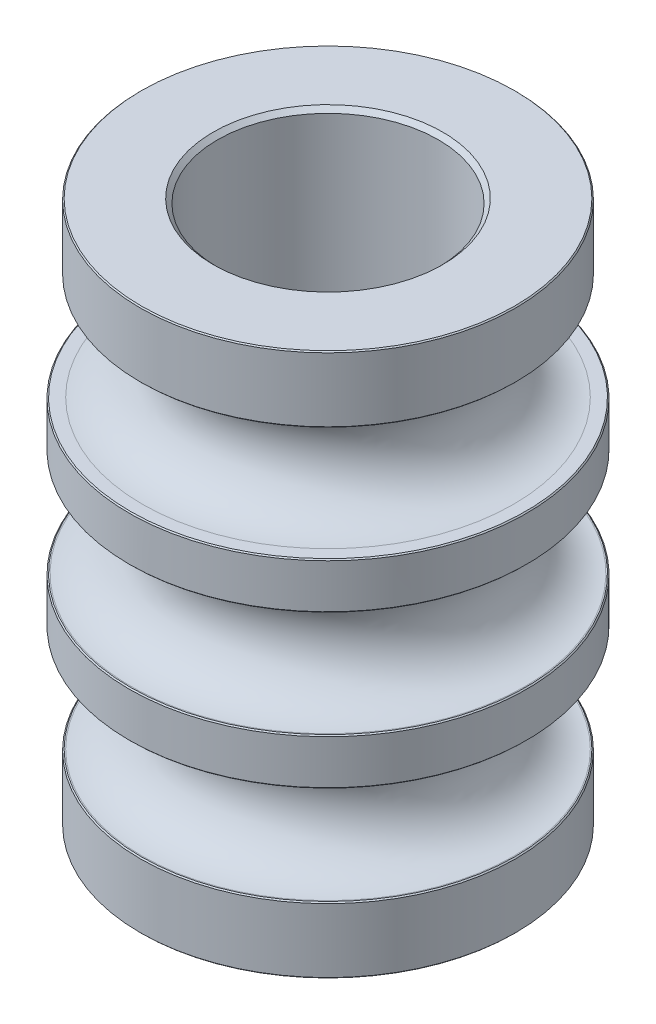
ISO-10303-21;
HEADER;
FILE_DESCRIPTION(('STEP AP214'),'2;1');
FILE_NAME('part.step','',(''),(''),'','','');
FILE_SCHEMA(('AUTOMOTIVE_DESIGN { 1 0 10303 214 1 1 1 1 }'));
ENDSEC;
DATA;
#1=APPLICATION_CONTEXT('core data for automotive mechanical design processes');
#2=APPLICATION_PROTOCOL_DEFINITION('international standard','automotive_design',2000,#1);
#3=PRODUCT_CONTEXT('',#1,'mechanical');
#4=PRODUCT('Part','Part','',(#3));
#5=PRODUCT_RELATED_PRODUCT_CATEGORY('part','',(#4));
#6=PRODUCT_DEFINITION_FORMATION('','',#4);
#7=PRODUCT_DEFINITION_CONTEXT('part definition',#1,'design');
#8=PRODUCT_DEFINITION('design','',#6,#7);
#9=PRODUCT_DEFINITION_SHAPE('','',#8);
#10=(LENGTH_UNIT() NAMED_UNIT(*) SI_UNIT(.MILLI.,.METRE.));
#11=(NAMED_UNIT(*) PLANE_ANGLE_UNIT() SI_UNIT($,.RADIAN.));
#12=(NAMED_UNIT(*) SI_UNIT($,.STERADIAN.) SOLID_ANGLE_UNIT());
#13=UNCERTAINTY_MEASURE_WITH_UNIT(LENGTH_MEASURE(1.E-05),#10,'distance_accuracy_value','');
#14=(GEOMETRIC_REPRESENTATION_CONTEXT(3) GLOBAL_UNCERTAINTY_ASSIGNED_CONTEXT((#13)) GLOBAL_UNIT_ASSIGNED_CONTEXT((#10,
#11,#12)) REPRESENTATION_CONTEXT('',''));
#15=CARTESIAN_POINT('',(0.,0.,0.));
#16=DIRECTION('',(0.,0.,1.));
#17=DIRECTION('',(1.,0.,0.));
#18=AXIS2_PLACEMENT_3D('',#15,#16,#17);
#19=CARTESIAN_POINT('',(0.,12.3,0.));
#20=DIRECTION('',(0.,-1.,0.));
#21=DIRECTION('',(0.,0.,-1.));
#22=AXIS2_PLACEMENT_3D('',#19,#20,#21);
#23=TOROIDAL_SURFACE('',#22,8.9,2.4);
#24=CARTESIAN_POINT('',(0.,9.9,0.));
#25=DIRECTION('',(0.,1.,0.));
#26=DIRECTION('',(1.,0.,0.));
#27=AXIS2_PLACEMENT_3D('',#24,#25,#26);
#28=CIRCLE('',#27,8.9);
#29=CARTESIAN_POINT('',(8.9,9.9,0.));
#30=VERTEX_POINT('',#29);
#31=EDGE_CURVE('E207',#30,#30,#28,.F.);
#32=ORIENTED_EDGE('',*,*,#31,.F.);
#33=EDGE_LOOP('',(#32));
#34=FACE_BOUND('',#33,.T.);
#35=CARTESIAN_POINT('',(0.,14.7,0.));
#36=DIRECTION('',(0.,-1.,0.));
#37=DIRECTION('',(1.,0.,0.));
#38=AXIS2_PLACEMENT_3D('',#35,#36,#37);
#39=CIRCLE('',#38,8.9);
#40=CARTESIAN_POINT('',(8.9,14.7,0.));
#41=VERTEX_POINT('',#40);
#42=EDGE_CURVE('E163',#41,#41,#39,.F.);
#43=ORIENTED_EDGE('',*,*,#42,.F.);
#44=EDGE_LOOP('',(#43));
#45=FACE_BOUND('',#44,.T.);
#46=ADVANCED_FACE('F15',(#34,#45),#23,.F.);
#47=CARTESIAN_POINT('',(8.95,9.9,0.));
#48=DIRECTION('',(0.,1.,0.));
#49=DIRECTION('',(0.,0.,1.));
#50=AXIS2_PLACEMENT_3D('',#47,#48,#49);
#51=PLANE('',#50);
#52=ORIENTED_EDGE('',*,*,#31,.T.);
#53=EDGE_LOOP('',(#52));
#54=FACE_BOUND('',#53,.T.);
#55=CARTESIAN_POINT('',(0.,9.90000000002244,0.));
#56=DIRECTION('',(0.,-1.,0.));
#57=DIRECTION('',(0.,0.,-1.));
#58=AXIS2_PLACEMENT_3D('',#55,#56,#57);
#59=CIRCLE('',#58,8.95000000002244);
#60=CARTESIAN_POINT('',(0.,9.90000000002244,-8.95000000002244));
#61=VERTEX_POINT('',#60);
#62=EDGE_CURVE('E20',#61,#61,#59,.T.);
#63=ORIENTED_EDGE('',*,*,#62,.F.);
#64=EDGE_LOOP('',(#63));
#65=FACE_BOUND('',#64,.T.);
#66=ADVANCED_FACE('F180',(#54,#65),#51,.T.);
#67=CARTESIAN_POINT('',(8.95,14.7,0.));
#68=DIRECTION('',(0.,-1.,0.));
#69=DIRECTION('',(0.,0.,-1.));
#70=AXIS2_PLACEMENT_3D('',#67,#68,#69);
#71=PLANE('',#70);
#72=ORIENTED_EDGE('',*,*,#42,.T.);
#73=EDGE_LOOP('',(#72));
#74=FACE_BOUND('',#73,.T.);
#75=CARTESIAN_POINT('',(0.,14.6999999999776,0.));
#76=DIRECTION('',(0.,1.,0.));
#77=DIRECTION('',(0.,0.,1.));
#78=AXIS2_PLACEMENT_3D('',#75,#76,#77);
#79=CIRCLE('',#78,8.95000000002244);
#80=CARTESIAN_POINT('',(0.,14.6999999999776,8.95000000002244));
#81=VERTEX_POINT('',#80);
#82=EDGE_CURVE('E156',#81,#81,#79,.T.);
#83=ORIENTED_EDGE('',*,*,#82,.F.);
#84=EDGE_LOOP('',(#83));
#85=FACE_BOUND('',#84,.T.);
#86=ADVANCED_FACE('F170',(#74,#85),#71,.T.);
#87=CARTESIAN_POINT('',(0.,9.84999999997756,0.));
#88=DIRECTION('',(0.,-1.,0.));
#89=DIRECTION('',(0.,0.,-1.));
#90=AXIS2_PLACEMENT_3D('',#87,#88,#89);
#91=CONICAL_SURFACE('',#90,8.99999999997756,0.785398162499989);
#92=CARTESIAN_POINT('',(0.,9.85,0.));
#93=DIRECTION('',(0.,-1.,0.));
#94=DIRECTION('',(0.,0.,-1.));
#95=AXIS2_PLACEMENT_3D('',#92,#93,#94);
#96=CIRCLE('',#95,9.);
#97=CARTESIAN_POINT('',(0.,9.85,-9.));
#98=VERTEX_POINT('',#97);
#99=EDGE_CURVE('E151',#98,#98,#96,.T.);
#100=ORIENTED_EDGE('',*,*,#99,.F.);
#101=EDGE_LOOP('',(#100));
#102=FACE_BOUND('',#101,.T.);
#103=ORIENTED_EDGE('',*,*,#62,.T.);
#104=EDGE_LOOP('',(#103));
#105=FACE_BOUND('',#104,.T.);
#106=ADVANCED_FACE('F179',(#102,#105),#91,.T.);
#107=CARTESIAN_POINT('',(0.,14.7500000000224,0.));
#108=DIRECTION('',(0.,1.,0.));
#109=DIRECTION('',(0.,0.,1.));
#110=AXIS2_PLACEMENT_3D('',#107,#108,#109);
#111=CONICAL_SURFACE('',#110,8.99999999997756,0.785398162500006);
#112=ORIENTED_EDGE('',*,*,#82,.T.);
#113=EDGE_LOOP('',(#112));
#114=FACE_BOUND('',#113,.T.);
#115=CARTESIAN_POINT('',(0.,14.75,0.));
#116=DIRECTION('',(0.,-1.,0.));
#117=DIRECTION('',(0.,0.,-1.));
#118=AXIS2_PLACEMENT_3D('',#115,#116,#117);
#119=CIRCLE('',#118,9.);
#120=CARTESIAN_POINT('',(0.,14.75,-9.));
#121=VERTEX_POINT('',#120);
#122=EDGE_CURVE('E146',#121,#121,#119,.F.);
#123=ORIENTED_EDGE('',*,*,#122,.F.);
#124=EDGE_LOOP('',(#123));
#125=FACE_BOUND('',#124,.T.);
#126=ADVANCED_FACE('F244',(#114,#125),#111,.T.);
#127=CARTESIAN_POINT('',(0.,8.85,0.));
#128=DIRECTION('',(0.,-1.,0.));
#129=DIRECTION('',(0.,0.,-1.));
#130=AXIS2_PLACEMENT_3D('',#127,#128,#129);
#131=CYLINDRICAL_SURFACE('',#130,9.);
#132=ORIENTED_EDGE('',*,*,#99,.T.);
#133=EDGE_LOOP('',(#132));
#134=FACE_BOUND('',#133,.T.);
#135=CARTESIAN_POINT('',(0.,7.85000000002244,0.));
#136=DIRECTION('',(0.,1.,0.));
#137=DIRECTION('',(-1.,0.,0.));
#138=AXIS2_PLACEMENT_3D('',#135,#136,#137);
#139=CIRCLE('',#138,8.99999999997757);
#140=CARTESIAN_POINT('',(-8.99999999997757,7.85000000002244,0.));
#141=VERTEX_POINT('',#140);
#142=EDGE_CURVE('E141',#141,#141,#139,.F.);
#143=ORIENTED_EDGE('',*,*,#142,.F.);
#144=EDGE_LOOP('',(#143));
#145=FACE_BOUND('',#144,.T.);
#146=ADVANCED_FACE('F250',(#134,#145),#131,.T.);
#147=CARTESIAN_POINT('',(0.,15.75,0.));
#148=DIRECTION('',(0.,-1.,0.));
#149=DIRECTION('',(0.,0.,-1.));
#150=AXIS2_PLACEMENT_3D('',#147,#148,#149);
#151=CYLINDRICAL_SURFACE('',#150,9.);
#152=CARTESIAN_POINT('',(0.,16.7499999999776,0.));
#153=DIRECTION('',(0.,-1.,0.));
#154=DIRECTION('',(-1.,0.,0.));
#155=AXIS2_PLACEMENT_3D('',#152,#153,#154);
#156=CIRCLE('',#155,8.99999999997756);
#157=CARTESIAN_POINT('',(-8.99999999997756,16.7499999999776,0.));
#158=VERTEX_POINT('',#157);
#159=EDGE_CURVE('E132',#158,#158,#156,.F.);
#160=ORIENTED_EDGE('',*,*,#159,.F.);
#161=EDGE_LOOP('',(#160));
#162=FACE_BOUND('',#161,.T.);
#163=ORIENTED_EDGE('',*,*,#122,.T.);
#164=EDGE_LOOP('',(#163));
#165=FACE_BOUND('',#164,.T.);
#166=ADVANCED_FACE('F358',(#162,#165),#151,.T.);
#167=CARTESIAN_POINT('',(0.,7.85000000002244,0.));
#168=DIRECTION('',(0.,1.,0.));
#169=DIRECTION('',(0.,0.,1.));
#170=AXIS2_PLACEMENT_3D('',#167,#168,#169);
#171=CONICAL_SURFACE('',#170,8.99999999997757,0.785398162500006);
#172=CARTESIAN_POINT('',(0.,7.79999999997756,0.));
#173=DIRECTION('',(0.,1.,0.));
#174=DIRECTION('',(0.,0.,1.));
#175=AXIS2_PLACEMENT_3D('',#172,#173,#174);
#176=CIRCLE('',#175,8.95000000002244);
#177=CARTESIAN_POINT('',(0.,7.79999999997756,8.95000000002244));
#178=VERTEX_POINT('',#177);
#179=EDGE_CURVE('E140',#178,#178,#176,.F.);
#180=ORIENTED_EDGE('',*,*,#179,.F.);
#181=EDGE_LOOP('',(#180));
#182=FACE_BOUND('',#181,.T.);
#183=ORIENTED_EDGE('',*,*,#142,.T.);
#184=EDGE_LOOP('',(#183));
#185=FACE_BOUND('',#184,.T.);
#186=ADVANCED_FACE('F350',(#182,#185),#171,.T.);
#187=CARTESIAN_POINT('',(0.,16.7499999999776,0.));
#188=DIRECTION('',(0.,-1.,0.));
#189=DIRECTION('',(0.,0.,-1.));
#190=AXIS2_PLACEMENT_3D('',#187,#188,#189);
#191=CONICAL_SURFACE('',#190,8.99999999997756,0.785398162500024);
#192=ORIENTED_EDGE('',*,*,#159,.T.);
#193=EDGE_LOOP('',(#192));
#194=FACE_BOUND('',#193,.T.);
#195=CARTESIAN_POINT('',(0.,16.8000000000224,0.));
#196=DIRECTION('',(0.,-1.,0.));
#197=DIRECTION('',(0.,0.,-1.));
#198=AXIS2_PLACEMENT_3D('',#195,#196,#197);
#199=CIRCLE('',#198,8.95000000002243);
#200=CARTESIAN_POINT('',(0.,16.8000000000224,-8.95000000002243));
#201=VERTEX_POINT('',#200);
#202=EDGE_CURVE('E231',#201,#201,#199,.F.);
#203=ORIENTED_EDGE('',*,*,#202,.F.);
#204=EDGE_LOOP('',(#203));
#205=FACE_BOUND('',#204,.T.);
#206=ADVANCED_FACE('F343',(#194,#205),#191,.T.);
#207=CARTESIAN_POINT('',(8.7,7.8,0.));
#208=DIRECTION('',(0.,-1.,0.));
#209=DIRECTION('',(0.,0.,-1.));
#210=AXIS2_PLACEMENT_3D('',#207,#208,#209);
#211=PLANE('',#210);
#212=CARTESIAN_POINT('',(0.,7.8,0.));
#213=DIRECTION('',(0.,-1.,0.));
#214=DIRECTION('',(1.,0.,0.));
#215=AXIS2_PLACEMENT_3D('',#212,#213,#214);
#216=CIRCLE('',#215,8.4);
#217=CARTESIAN_POINT('',(8.4,7.8,0.));
#218=VERTEX_POINT('',#217);
#219=EDGE_CURVE('E234',#218,#218,#216,.F.);
#220=ORIENTED_EDGE('',*,*,#219,.T.);
#221=EDGE_LOOP('',(#220));
#222=FACE_BOUND('',#221,.T.);
#223=ORIENTED_EDGE('',*,*,#179,.T.);
#224=EDGE_LOOP('',(#223));
#225=FACE_BOUND('',#224,.T.);
#226=ADVANCED_FACE('F336',(#222,#225),#211,.T.);
#227=CARTESIAN_POINT('',(8.7,16.8,0.));
#228=DIRECTION('',(0.,1.,0.));
#229=DIRECTION('',(0.,0.,1.));
#230=AXIS2_PLACEMENT_3D('',#227,#228,#229);
#231=PLANE('',#230);
#232=CARTESIAN_POINT('',(0.,16.8,0.));
#233=DIRECTION('',(0.,1.,0.));
#234=DIRECTION('',(1.,0.,0.));
#235=AXIS2_PLACEMENT_3D('',#232,#233,#234);
#236=CIRCLE('',#235,8.4);
#237=CARTESIAN_POINT('',(8.4,16.8,0.));
#238=VERTEX_POINT('',#237);
#239=EDGE_CURVE('E511',#238,#238,#236,.F.);
#240=ORIENTED_EDGE('',*,*,#239,.T.);
#241=EDGE_LOOP('',(#240));
#242=FACE_BOUND('',#241,.T.);
#243=ORIENTED_EDGE('',*,*,#202,.T.);
#244=EDGE_LOOP('',(#243));
#245=FACE_BOUND('',#244,.T.);
#246=ADVANCED_FACE('F117',(#242,#245),#231,.T.);
#247=CARTESIAN_POINT('',(0.,5.4,0.));
#248=DIRECTION('',(0.,-1.,0.));
#249=DIRECTION('',(0.,0.,-1.));
#250=AXIS2_PLACEMENT_3D('',#247,#248,#249);
#251=TOROIDAL_SURFACE('',#250,8.4,2.4);
#252=CARTESIAN_POINT('',(0.,3.,0.));
#253=DIRECTION('',(0.,1.,0.));
#254=DIRECTION('',(1.,0.,0.));
#255=AXIS2_PLACEMENT_3D('',#252,#253,#254);
#256=CIRCLE('',#255,8.4);
#257=CARTESIAN_POINT('',(8.4,3.,0.));
#258=VERTEX_POINT('',#257);
#259=EDGE_CURVE('E520',#258,#258,#256,.F.);
#260=ORIENTED_EDGE('',*,*,#259,.F.);
#261=EDGE_LOOP('',(#260));
#262=FACE_BOUND('',#261,.T.);
#263=ORIENTED_EDGE('',*,*,#219,.F.);
#264=EDGE_LOOP('',(#263));
#265=FACE_BOUND('',#264,.T.);
#266=ADVANCED_FACE('F113',(#262,#265),#251,.F.);
#267=CARTESIAN_POINT('',(0.,19.2,0.));
#268=DIRECTION('',(0.,-1.,0.));
#269=DIRECTION('',(0.,0.,-1.));
#270=AXIS2_PLACEMENT_3D('',#267,#268,#269);
#271=TOROIDAL_SURFACE('',#270,8.4,2.4);
#272=ORIENTED_EDGE('',*,*,#239,.F.);
#273=EDGE_LOOP('',(#272));
#274=FACE_BOUND('',#273,.T.);
#275=CARTESIAN_POINT('',(0.,21.6,0.));
#276=DIRECTION('',(0.,-1.,0.));
#277=DIRECTION('',(1.,0.,0.));
#278=AXIS2_PLACEMENT_3D('',#275,#276,#277);
#279=CIRCLE('',#278,8.4);
#280=CARTESIAN_POINT('',(8.4,21.6,0.));
#281=VERTEX_POINT('',#280);
#282=EDGE_CURVE('E62',#281,#281,#279,.F.);
#283=ORIENTED_EDGE('',*,*,#282,.F.);
#284=EDGE_LOOP('',(#283));
#285=FACE_BOUND('',#284,.T.);
#286=ADVANCED_FACE('F85',(#274,#285),#271,.F.);
#287=CARTESIAN_POINT('',(8.45,3.,0.));
#288=DIRECTION('',(0.,1.,0.));
#289=DIRECTION('',(0.,0.,1.));
#290=AXIS2_PLACEMENT_3D('',#287,#288,#289);
#291=PLANE('',#290);
#292=ORIENTED_EDGE('',*,*,#259,.T.);
#293=EDGE_LOOP('',(#292));
#294=FACE_BOUND('',#293,.T.);
#295=CARTESIAN_POINT('',(0.,3.00000000002244,0.));
#296=DIRECTION('',(0.,-1.,0.));
#297=DIRECTION('',(0.,0.,-1.));
#298=AXIS2_PLACEMENT_3D('',#295,#296,#297);
#299=CIRCLE('',#298,8.45000000002244);
#300=CARTESIAN_POINT('',(0.,3.00000000002244,-8.45000000002244));
#301=VERTEX_POINT('',#300);
#302=EDGE_CURVE('E228',#301,#301,#299,.T.);
#303=ORIENTED_EDGE('',*,*,#302,.F.);
#304=EDGE_LOOP('',(#303));
#305=FACE_BOUND('',#304,.T.);
#306=ADVANCED_FACE('F80',(#294,#305),#291,.T.);
#307=CARTESIAN_POINT('',(8.45,21.6,0.));
#308=DIRECTION('',(0.,-1.,0.));
#309=DIRECTION('',(0.,0.,-1.));
#310=AXIS2_PLACEMENT_3D('',#307,#308,#309);
#311=PLANE('',#310);
#312=ORIENTED_EDGE('',*,*,#282,.T.);
#313=EDGE_LOOP('',(#312));
#314=FACE_BOUND('',#313,.T.);
#315=CARTESIAN_POINT('',(0.,21.5999999999776,0.));
#316=DIRECTION('',(0.,1.,0.));
#317=DIRECTION('',(0.,0.,1.));
#318=AXIS2_PLACEMENT_3D('',#315,#316,#317);
#319=CIRCLE('',#318,8.45000000002244);
#320=CARTESIAN_POINT('',(0.,21.5999999999776,8.45000000002244));
#321=VERTEX_POINT('',#320);
#322=EDGE_CURVE('E55',#321,#321,#319,.T.);
#323=ORIENTED_EDGE('',*,*,#322,.F.);
#324=EDGE_LOOP('',(#323));
#325=FACE_BOUND('',#324,.T.);
#326=ADVANCED_FACE('F69',(#314,#325),#311,.T.);
#327=CARTESIAN_POINT('',(0.,2.94999999997757,0.));
#328=DIRECTION('',(0.,-1.,0.));
#329=DIRECTION('',(0.,0.,-1.));
#330=AXIS2_PLACEMENT_3D('',#327,#328,#329);
#331=CONICAL_SURFACE('',#330,8.49999999997756,0.785398162500006);
#332=CARTESIAN_POINT('',(0.,2.95,0.));
#333=DIRECTION('',(0.,-1.,0.));
#334=DIRECTION('',(0.,0.,-1.));
#335=AXIS2_PLACEMENT_3D('',#332,#333,#334);
#336=CIRCLE('',#335,8.5);
#337=CARTESIAN_POINT('',(0.,2.95,-8.5));
#338=VERTEX_POINT('',#337);
#339=EDGE_CURVE('E50',#338,#338,#336,.T.);
#340=ORIENTED_EDGE('',*,*,#339,.F.);
#341=EDGE_LOOP('',(#340));
#342=FACE_BOUND('',#341,.T.);
#343=ORIENTED_EDGE('',*,*,#302,.T.);
#344=EDGE_LOOP('',(#343));
#345=FACE_BOUND('',#344,.T.);
#346=ADVANCED_FACE('F79',(#342,#345),#331,.T.);
#347=CARTESIAN_POINT('',(0.,21.6500000000224,0.));
#348=DIRECTION('',(0.,1.,0.));
#349=DIRECTION('',(0.,0.,1.));
#350=AXIS2_PLACEMENT_3D('',#347,#348,#349);
#351=CONICAL_SURFACE('',#350,8.49999999997756,0.785398162500006);
#352=ORIENTED_EDGE('',*,*,#322,.T.);
#353=EDGE_LOOP('',(#352));
#354=FACE_BOUND('',#353,.T.);
#355=CARTESIAN_POINT('',(0.,21.65,0.));
#356=DIRECTION('',(0.,-1.,0.));
#357=DIRECTION('',(0.,0.,-1.));
#358=AXIS2_PLACEMENT_3D('',#355,#356,#357);
#359=CIRCLE('',#358,8.5);
#360=CARTESIAN_POINT('',(0.,21.65,-8.5));
#361=VERTEX_POINT('',#360);
#362=EDGE_CURVE('E45',#361,#361,#359,.F.);
#363=ORIENTED_EDGE('',*,*,#362,.F.);
#364=EDGE_LOOP('',(#363));
#365=FACE_BOUND('',#364,.T.);
#366=ADVANCED_FACE('F290',(#354,#365),#351,.T.);
#367=CARTESIAN_POINT('',(0.,1.5,0.));
#368=DIRECTION('',(0.,-1.,0.));
#369=DIRECTION('',(0.,0.,-1.));
#370=AXIS2_PLACEMENT_3D('',#367,#368,#369);
#371=CYLINDRICAL_SURFACE('',#370,8.5);
#372=CARTESIAN_POINT('',(0.,0.0500000000224349,0.));
#373=DIRECTION('',(0.,1.,0.));
#374=DIRECTION('',(-1.,0.,0.));
#375=AXIS2_PLACEMENT_3D('',#372,#373,#374);
#376=CIRCLE('',#375,8.49999999997756);
#377=CARTESIAN_POINT('',(-8.49999999997756,0.0500000000224354,0.));
#378=VERTEX_POINT('',#377);
#379=EDGE_CURVE('E40',#378,#378,#376,.F.);
#380=ORIENTED_EDGE('',*,*,#379,.F.);
#381=EDGE_LOOP('',(#380));
#382=FACE_BOUND('',#381,.T.);
#383=ORIENTED_EDGE('',*,*,#339,.T.);
#384=EDGE_LOOP('',(#383));
#385=FACE_BOUND('',#384,.T.);
#386=ADVANCED_FACE('F287',(#382,#385),#371,.T.);
#387=CARTESIAN_POINT('',(0.,23.1,0.));
#388=DIRECTION('',(0.,-1.,0.));
#389=DIRECTION('',(0.,0.,-1.));
#390=AXIS2_PLACEMENT_3D('',#387,#388,#389);
#391=CYLINDRICAL_SURFACE('',#390,8.5);
#392=CARTESIAN_POINT('',(0.,24.5499999999776,0.));
#393=DIRECTION('',(0.,-1.,0.));
#394=DIRECTION('',(-1.,0.,0.));
#395=AXIS2_PLACEMENT_3D('',#392,#393,#394);
#396=CIRCLE('',#395,8.49999999997756);
#397=CARTESIAN_POINT('',(-8.49999999997756,24.5499999999776,0.));
#398=VERTEX_POINT('',#397);
#399=EDGE_CURVE('E36',#398,#398,#396,.F.);
#400=ORIENTED_EDGE('',*,*,#399,.F.);
#401=EDGE_LOOP('',(#400));
#402=FACE_BOUND('',#401,.T.);
#403=ORIENTED_EDGE('',*,*,#362,.T.);
#404=EDGE_LOOP('',(#403));
#405=FACE_BOUND('',#404,.T.);
#406=ADVANCED_FACE('F283',(#402,#405),#391,.T.);
#407=CARTESIAN_POINT('',(0.,0.0500000000224358,0.));
#408=DIRECTION('',(0.,1.,0.));
#409=DIRECTION('',(0.,0.,1.));
#410=AXIS2_PLACEMENT_3D('',#407,#408,#409);
#411=CONICAL_SURFACE('',#410,8.49999999997756,0.785398162500001);
#412=CARTESIAN_POINT('',(0.,-2.24368185705939E-11,0.));
#413=DIRECTION('',(0.,1.,0.));
#414=DIRECTION('',(0.,0.,1.));
#415=AXIS2_PLACEMENT_3D('',#412,#413,#414);
#416=CIRCLE('',#415,8.45000000002244);
#417=CARTESIAN_POINT('',(0.,-2.24368185705939E-11,8.45000000002244));
#418=VERTEX_POINT('',#417);
#419=EDGE_CURVE('E39',#418,#418,#416,.F.);
#420=ORIENTED_EDGE('',*,*,#419,.F.);
#421=EDGE_LOOP('',(#420));
#422=FACE_BOUND('',#421,.T.);
#423=ORIENTED_EDGE('',*,*,#379,.T.);
#424=EDGE_LOOP('',(#423));
#425=FACE_BOUND('',#424,.T.);
#426=ADVANCED_FACE('F279',(#422,#425),#411,.T.);
#427=CARTESIAN_POINT('',(0.,24.5499999999776,0.));
#428=DIRECTION('',(0.,-1.,0.));
#429=DIRECTION('',(0.,0.,-1.));
#430=AXIS2_PLACEMENT_3D('',#427,#428,#429);
#431=CONICAL_SURFACE('',#430,8.49999999997756,0.785398162500006);
#432=ORIENTED_EDGE('',*,*,#399,.T.);
#433=EDGE_LOOP('',(#432));
#434=FACE_BOUND('',#433,.T.);
#435=CARTESIAN_POINT('',(0.,24.6000000000224,0.));
#436=DIRECTION('',(0.,-1.,0.));
#437=DIRECTION('',(0.,0.,-1.));
#438=AXIS2_PLACEMENT_3D('',#435,#436,#437);
#439=CIRCLE('',#438,8.45000000002244);
#440=CARTESIAN_POINT('',(0.,24.6000000000224,-8.45000000002244));
#441=VERTEX_POINT('',#440);
#442=EDGE_CURVE('E221',#441,#441,#439,.F.);
#443=ORIENTED_EDGE('',*,*,#442,.F.);
#444=EDGE_LOOP('',(#443));
#445=FACE_BOUND('',#444,.T.);
#446=ADVANCED_FACE('F275',(#434,#445),#431,.T.);
#447=CARTESIAN_POINT('',(4.25,0.,0.));
#448=DIRECTION('',(0.,-1.,0.));
#449=DIRECTION('',(0.,0.,-1.));
#450=AXIS2_PLACEMENT_3D('',#447,#448,#449);
#451=PLANE('',#450);
#452=CARTESIAN_POINT('',(0.,-1.13686837721616E-10,0.));
#453=DIRECTION('',(0.,-1.,0.));
#454=DIRECTION('',(0.,0.,-1.));
#455=AXIS2_PLACEMENT_3D('',#452,#453,#454);
#456=CIRCLE('',#455,5.19999999988841);
#457=CARTESIAN_POINT('',(0.,-1.13686837721616E-10,-5.19999999988841));
#458=VERTEX_POINT('',#457);
#459=EDGE_CURVE('E218',#458,#458,#456,.F.);
#460=ORIENTED_EDGE('',*,*,#459,.T.);
#461=EDGE_LOOP('',(#460));
#462=FACE_BOUND('',#461,.T.);
#463=ORIENTED_EDGE('',*,*,#419,.T.);
#464=EDGE_LOOP('',(#463));
#465=FACE_BOUND('',#464,.T.);
#466=ADVANCED_FACE('F271',(#462,#465),#451,.T.);
#467=CARTESIAN_POINT('',(4.25,24.6,0.));
#468=DIRECTION('',(0.,1.,0.));
#469=DIRECTION('',(0.,0.,1.));
#470=AXIS2_PLACEMENT_3D('',#467,#468,#469);
#471=PLANE('',#470);
#472=CARTESIAN_POINT('',(0.,24.6000000000777,0.));
#473=DIRECTION('',(0.,1.,0.));
#474=DIRECTION('',(0.,0.,1.));
#475=AXIS2_PLACEMENT_3D('',#472,#473,#474);
#476=CIRCLE('',#475,5.19999999994525);
#477=CARTESIAN_POINT('',(0.,24.6000000000777,5.19999999994525));
#478=VERTEX_POINT('',#477);
#479=EDGE_CURVE('E29',#478,#478,#476,.F.);
#480=ORIENTED_EDGE('',*,*,#479,.T.);
#481=EDGE_LOOP('',(#480));
#482=FACE_BOUND('',#481,.T.);
#483=ORIENTED_EDGE('',*,*,#442,.T.);
#484=EDGE_LOOP('',(#483));
#485=FACE_BOUND('',#484,.T.);
#486=ADVANCED_FACE('F267',(#482,#485),#471,.T.);
#487=CARTESIAN_POINT('',(0.,-1.13686837721616E-10,0.));
#488=DIRECTION('',(0.,-1.,0.));
#489=DIRECTION('',(0.,0.,-1.));
#490=AXIS2_PLACEMENT_3D('',#487,#488,#489);
#491=CONICAL_SURFACE('',#490,5.19999999988841,0.785398162544797);
#492=ORIENTED_EDGE('',*,*,#459,.F.);
#493=EDGE_LOOP('',(#492));
#494=FACE_BOUND('',#493,.T.);
#495=CARTESIAN_POINT('',(0.,0.200000000000001,0.));
#496=DIRECTION('',(0.,1.,0.));
#497=DIRECTION('',(0.,0.,1.));
#498=AXIS2_PLACEMENT_3D('',#495,#496,#497);
#499=CIRCLE('',#498,5.);
#500=CARTESIAN_POINT('',(0.,0.200000000000001,5.));
#501=VERTEX_POINT('',#500);
#502=EDGE_CURVE('E24',#501,#501,#499,.T.);
#503=ORIENTED_EDGE('',*,*,#502,.T.);
#504=EDGE_LOOP('',(#503));
#505=FACE_BOUND('',#504,.T.);
#506=ADVANCED_FACE('F260',(#494,#505),#491,.F.);
#507=CARTESIAN_POINT('',(0.,24.599999999964,0.));
#508=DIRECTION('',(0.,1.,0.));
#509=DIRECTION('',(0.,0.,1.));
#510=AXIS2_PLACEMENT_3D('',#507,#508,#509);
#511=CONICAL_SURFACE('',#510,5.19999999983156,0.785398162544797);
#512=ORIENTED_EDGE('',*,*,#479,.F.);
#513=EDGE_LOOP('',(#512));
#514=FACE_BOUND('',#513,.T.);
#515=CARTESIAN_POINT('',(0.,24.4,0.));
#516=DIRECTION('',(0.,1.,0.));
#517=DIRECTION('',(0.,0.,1.));
#518=AXIS2_PLACEMENT_3D('',#515,#516,#517);
#519=CIRCLE('',#518,5.);
#520=CARTESIAN_POINT('',(0.,24.4,5.));
#521=VERTEX_POINT('',#520);
#522=EDGE_CURVE('E10',#521,#521,#519,.F.);
#523=ORIENTED_EDGE('',*,*,#522,.T.);
#524=EDGE_LOOP('',(#523));
#525=FACE_BOUND('',#524,.T.);
#526=ADVANCED_FACE('F254',(#514,#525),#511,.F.);
#527=CARTESIAN_POINT('',(0.,-10.6195477358383,0.));
#528=DIRECTION('',(0.,1.,0.));
#529=DIRECTION('',(0.,0.,1.));
#530=AXIS2_PLACEMENT_3D('',#527,#528,#529);
#531=CYLINDRICAL_SURFACE('',#530,5.);
#532=ORIENTED_EDGE('',*,*,#522,.F.);
#533=EDGE_LOOP('',(#532));
#534=FACE_BOUND('',#533,.T.);
#535=ORIENTED_EDGE('',*,*,#502,.F.);
#536=EDGE_LOOP('',(#535));
#537=FACE_BOUND('',#536,.T.);
#538=ADVANCED_FACE('F252',(#534,#537),#531,.F.);
#539=CLOSED_SHELL('',(#46,#66,#86,#106,#126,#146,#166,#186,#206,#226,#246,#266,#286,#306,#326,
#346,#366,#386,#406,#426,#446,#466,#486,#506,#526,#538));
#540=MANIFOLD_SOLID_BREP('B1',#539);
#541=ADVANCED_BREP_SHAPE_REPRESENTATION('',(#18,#540),#14);
#542=SHAPE_DEFINITION_REPRESENTATION(#9,#541);
ENDSEC;
END-ISO-10303-21;
